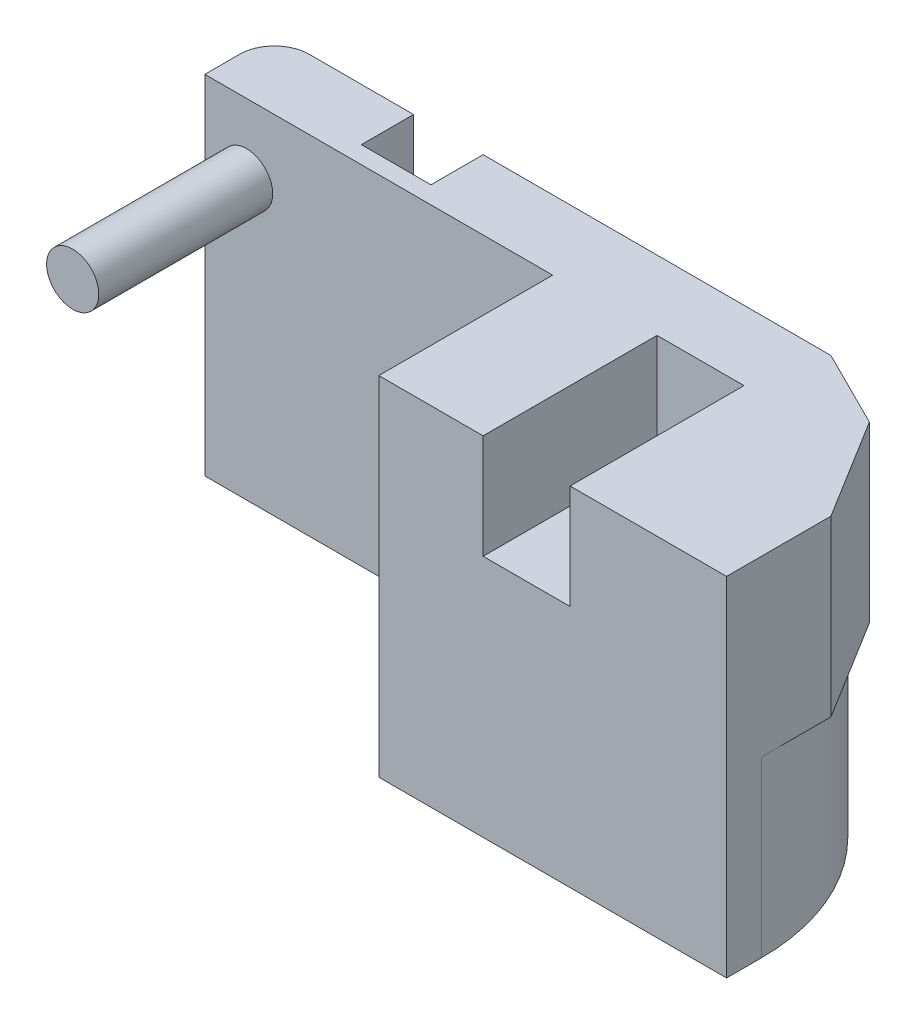
ISO-10303-21;
HEADER;
FILE_DESCRIPTION(('STEP AP214'),'2;1');
FILE_NAME('part.step','',(''),(''),'','','');
FILE_SCHEMA(('AUTOMOTIVE_DESIGN { 1 0 10303 214 1 1 1 1 }'));
ENDSEC;
DATA;
#1=APPLICATION_CONTEXT('core data for automotive mechanical design processes');
#2=APPLICATION_PROTOCOL_DEFINITION('international standard','automotive_design',2000,#1);
#3=PRODUCT_CONTEXT('',#1,'mechanical');
#4=PRODUCT('Part','Part','',(#3));
#5=PRODUCT_RELATED_PRODUCT_CATEGORY('part','',(#4));
#6=PRODUCT_DEFINITION_FORMATION('','',#4);
#7=PRODUCT_DEFINITION_CONTEXT('part definition',#1,'design');
#8=PRODUCT_DEFINITION('design','',#6,#7);
#9=PRODUCT_DEFINITION_SHAPE('','',#8);
#10=(LENGTH_UNIT() NAMED_UNIT(*) SI_UNIT(.MILLI.,.METRE.));
#11=(NAMED_UNIT(*) PLANE_ANGLE_UNIT() SI_UNIT($,.RADIAN.));
#12=(NAMED_UNIT(*) SI_UNIT($,.STERADIAN.) SOLID_ANGLE_UNIT());
#13=UNCERTAINTY_MEASURE_WITH_UNIT(LENGTH_MEASURE(1.E-05),#10,'distance_accuracy_value','');
#14=(GEOMETRIC_REPRESENTATION_CONTEXT(3) GLOBAL_UNCERTAINTY_ASSIGNED_CONTEXT((#13)) GLOBAL_UNIT_ASSIGNED_CONTEXT((#10,
#11,#12)) REPRESENTATION_CONTEXT('',''));
#15=CARTESIAN_POINT('',(0.,0.,0.));
#16=DIRECTION('',(0.,0.,1.));
#17=DIRECTION('',(1.,0.,0.));
#18=AXIS2_PLACEMENT_3D('',#15,#16,#17);
#19=CARTESIAN_POINT('',(0.,0.,20.));
#20=DIRECTION('',(0.,0.,-1.));
#21=DIRECTION('',(-1.,0.,0.));
#22=AXIS2_PLACEMENT_3D('',#19,#20,#21);
#23=PLANE('',#22);
#24=DIRECTION('',(-1.,0.,0.));
#25=VECTOR('',#24,1.);
#26=CARTESIAN_POINT('',(0.,100.,20.));
#27=LINE('',#26,#25);
#28=CARTESIAN_POINT('',(155.,100.,20.));
#29=VERTEX_POINT('',#28);
#30=CARTESIAN_POINT('',(130.,100.,20.));
#31=VERTEX_POINT('',#30);
#32=EDGE_CURVE('E331',#29,#31,#27,.T.);
#33=ORIENTED_EDGE('',*,*,#32,.T.);
#34=DIRECTION('',(0.,-1.,0.));
#35=VECTOR('',#34,1.);
#36=CARTESIAN_POINT('',(130.,100.,20.));
#37=LINE('',#36,#35);
#38=CARTESIAN_POINT('',(130.,70.,20.));
#39=VERTEX_POINT('',#38);
#40=EDGE_CURVE('E274',#31,#39,#37,.T.);
#41=ORIENTED_EDGE('',*,*,#40,.T.);
#42=DIRECTION('',(1.,0.,0.));
#43=VECTOR('',#42,1.);
#44=CARTESIAN_POINT('',(130.,70.,20.));
#45=LINE('',#44,#43);
#46=CARTESIAN_POINT('',(155.,70.,20.));
#47=VERTEX_POINT('',#46);
#48=EDGE_CURVE('E302',#39,#47,#45,.T.);
#49=ORIENTED_EDGE('',*,*,#48,.T.);
#50=DIRECTION('',(0.,-1.,0.));
#51=VECTOR('',#50,1.);
#52=CARTESIAN_POINT('',(155.,100.,20.));
#53=LINE('',#52,#51);
#54=EDGE_CURVE('E305',#29,#47,#53,.T.);
#55=ORIENTED_EDGE('',*,*,#54,.F.);
#56=EDGE_LOOP('',(#33,#41,#49,#55));
#57=FACE_BOUND('',#56,.T.);
#58=ADVANCED_FACE('F40',(#57),#23,.F.);
#59=CARTESIAN_POINT('',(0.,0.,20.));
#60=DIRECTION('',(1.,0.,0.));
#61=DIRECTION('',(0.,0.,-1.));
#62=AXIS2_PLACEMENT_3D('',#59,#60,#61);
#63=PLANE('',#62);
#64=DIRECTION('',(0.,0.,-1.));
#65=VECTOR('',#64,1.);
#66=CARTESIAN_POINT('',(0.,50.,10.));
#67=LINE('',#66,#65);
#68=CARTESIAN_POINT('',(0.,50.,10.));
#69=VERTEX_POINT('',#68);
#70=CARTESIAN_POINT('',(0.,50.,5.00000000000003));
#71=VERTEX_POINT('',#70);
#72=EDGE_CURVE('E350',#69,#71,#67,.T.);
#73=ORIENTED_EDGE('',*,*,#72,.T.);
#74=DIRECTION('',(0.,-1.,0.));
#75=VECTOR('',#74,1.);
#76=CARTESIAN_POINT('',(0.,0.,5.00000000000003));
#77=LINE('',#76,#75);
#78=CARTESIAN_POINT('',(0.,0.,5.00000000000003));
#79=VERTEX_POINT('',#78);
#80=EDGE_CURVE('E362',#71,#79,#77,.T.);
#81=ORIENTED_EDGE('',*,*,#80,.T.);
#82=DIRECTION('',(0.,0.,-1.));
#83=VECTOR('',#82,1.);
#84=CARTESIAN_POINT('',(0.,0.,20.));
#85=LINE('',#84,#83);
#86=CARTESIAN_POINT('',(0.,0.,20.));
#87=VERTEX_POINT('',#86);
#88=EDGE_CURVE('E344',#87,#79,#85,.T.);
#89=ORIENTED_EDGE('',*,*,#88,.F.);
#90=DIRECTION('',(0.,-1.,0.));
#91=VECTOR('',#90,1.);
#92=CARTESIAN_POINT('',(0.,0.,20.));
#93=LINE('',#92,#91);
#94=CARTESIAN_POINT('',(0.,100.,20.));
#95=VERTEX_POINT('',#94);
#96=EDGE_CURVE('E322',#95,#87,#93,.T.);
#97=ORIENTED_EDGE('',*,*,#96,.F.);
#98=DIRECTION('',(0.,0.,-1.));
#99=VECTOR('',#98,1.);
#100=CARTESIAN_POINT('',(0.,100.,20.));
#101=LINE('',#100,#99);
#102=CARTESIAN_POINT('',(0.,100.,10.));
#103=VERTEX_POINT('',#102);
#104=EDGE_CURVE('E336',#95,#103,#101,.T.);
#105=ORIENTED_EDGE('',*,*,#104,.T.);
#106=DIRECTION('',(0.,-1.,0.));
#107=VECTOR('',#106,1.);
#108=CARTESIAN_POINT('',(0.,0.,10.));
#109=LINE('',#108,#107);
#110=EDGE_CURVE('E353',#103,#69,#109,.T.);
#111=ORIENTED_EDGE('',*,*,#110,.T.);
#112=EDGE_LOOP('',(#73,#81,#89,#97,#105,#111));
#113=FACE_BOUND('',#112,.T.);
#114=ADVANCED_FACE('F434',(#113),#63,.F.);
#115=CARTESIAN_POINT('',(0.,0.,20.));
#116=DIRECTION('',(0.,1.,0.));
#117=DIRECTION('',(0.,0.,1.));
#118=AXIS2_PLACEMENT_3D('',#115,#116,#117);
#119=PLANE('',#118);
#120=DIRECTION('',(1.,0.,0.));
#121=VECTOR('',#120,1.);
#122=CARTESIAN_POINT('',(0.,0.,0.));
#123=LINE('',#122,#121);
#124=CARTESIAN_POINT('',(5.00000000000006,0.,0.));
#125=VERTEX_POINT('',#124);
#126=CARTESIAN_POINT('',(140.,0.,0.));
#127=VERTEX_POINT('',#126);
#128=EDGE_CURVE('E312',#125,#127,#123,.T.);
#129=ORIENTED_EDGE('',*,*,#128,.T.);
#130=CARTESIAN_POINT('',(140.,0.,60.));
#131=DIRECTION('',(0.,1.,0.));
#132=DIRECTION('',(0.,0.,1.));
#133=AXIS2_PLACEMENT_3D('',#130,#131,#132);
#134=CIRCLE('',#133,60.);
#135=CARTESIAN_POINT('',(200.,0.,60.));
#136=VERTEX_POINT('',#135);
#137=EDGE_CURVE('E382',#127,#136,#134,.F.);
#138=ORIENTED_EDGE('',*,*,#137,.T.);
#139=DIRECTION('',(0.,0.,-1.));
#140=VECTOR('',#139,1.);
#141=CARTESIAN_POINT('',(200.,0.,20.));
#142=LINE('',#141,#140);
#143=CARTESIAN_POINT('',(200.,0.,70.));
#144=VERTEX_POINT('',#143);
#145=EDGE_CURVE('E341',#144,#136,#142,.T.);
#146=ORIENTED_EDGE('',*,*,#145,.F.);
#147=DIRECTION('',(1.,0.,0.));
#148=VECTOR('',#147,1.);
#149=CARTESIAN_POINT('',(100.,0.,70.));
#150=LINE('',#149,#148);
#151=CARTESIAN_POINT('',(100.,0.,70.));
#152=VERTEX_POINT('',#151);
#153=EDGE_CURVE('E293',#152,#144,#150,.T.);
#154=ORIENTED_EDGE('',*,*,#153,.F.);
#155=DIRECTION('',(0.,0.,-1.));
#156=VECTOR('',#155,1.);
#157=CARTESIAN_POINT('',(100.,0.,70.));
#158=LINE('',#157,#156);
#159=CARTESIAN_POINT('',(100.,0.,20.));
#160=VERTEX_POINT('',#159);
#161=EDGE_CURVE('E313',#152,#160,#158,.T.);
#162=ORIENTED_EDGE('',*,*,#161,.T.);
#163=DIRECTION('',(1.,0.,0.));
#164=VECTOR('',#163,1.);
#165=CARTESIAN_POINT('',(0.,0.,20.));
#166=LINE('',#165,#164);
#167=EDGE_CURVE('E325',#87,#160,#166,.T.);
#168=ORIENTED_EDGE('',*,*,#167,.F.);
#169=ORIENTED_EDGE('',*,*,#88,.T.);
#170=DIRECTION('',(0.707106781186549,0.,-0.707106781186546));
#171=VECTOR('',#170,1.);
#172=CARTESIAN_POINT('',(0.,0.,5.00000000000003));
#173=LINE('',#172,#171);
#174=EDGE_CURVE('E366',#79,#125,#173,.T.);
#175=ORIENTED_EDGE('',*,*,#174,.T.);
#176=EDGE_LOOP('',(#129,#138,#146,#154,#162,#168,#169,#175));
#177=FACE_BOUND('',#176,.T.);
#178=ADVANCED_FACE('F441',(#177),#119,.F.);
#179=CARTESIAN_POINT('',(200.,0.,20.));
#180=DIRECTION('',(-1.,0.,0.));
#181=DIRECTION('',(0.,0.,1.));
#182=AXIS2_PLACEMENT_3D('',#179,#180,#181);
#183=PLANE('',#182);
#184=DIRECTION('',(0.,0.,-1.));
#185=VECTOR('',#184,1.);
#186=CARTESIAN_POINT('',(200.,49.9999999999999,60.));
#187=LINE('',#186,#185);
#188=CARTESIAN_POINT('',(200.,49.9999999999999,60.));
#189=VERTEX_POINT('',#188);
#190=CARTESIAN_POINT('',(200.,49.9999999999999,40.0000000000002));
#191=VERTEX_POINT('',#190);
#192=EDGE_CURVE('E372',#189,#191,#187,.T.);
#193=ORIENTED_EDGE('',*,*,#192,.T.);
#194=DIRECTION('',(0.,1.,0.));
#195=VECTOR('',#194,1.);
#196=CARTESIAN_POINT('',(200.,100.,40.0000000000002));
#197=LINE('',#196,#195);
#198=CARTESIAN_POINT('',(200.,100.,40.0000000000002));
#199=VERTEX_POINT('',#198);
#200=EDGE_CURVE('E391',#191,#199,#197,.T.);
#201=ORIENTED_EDGE('',*,*,#200,.T.);
#202=DIRECTION('',(0.,0.,-1.));
#203=VECTOR('',#202,1.);
#204=CARTESIAN_POINT('',(200.,100.,20.));
#205=LINE('',#204,#203);
#206=CARTESIAN_POINT('',(200.,100.,70.));
#207=VERTEX_POINT('',#206);
#208=EDGE_CURVE('E339',#207,#199,#205,.T.);
#209=ORIENTED_EDGE('',*,*,#208,.F.);
#210=DIRECTION('',(0.,1.,0.));
#211=VECTOR('',#210,1.);
#212=CARTESIAN_POINT('',(200.,0.,70.));
#213=LINE('',#212,#211);
#214=EDGE_CURVE('E290',#144,#207,#213,.T.);
#215=ORIENTED_EDGE('',*,*,#214,.F.);
#216=ORIENTED_EDGE('',*,*,#145,.T.);
#217=DIRECTION('',(0.,1.,0.));
#218=VECTOR('',#217,1.);
#219=CARTESIAN_POINT('',(200.,100.,60.));
#220=LINE('',#219,#218);
#221=EDGE_CURVE('E375',#136,#189,#220,.T.);
#222=ORIENTED_EDGE('',*,*,#221,.T.);
#223=EDGE_LOOP('',(#193,#201,#209,#215,#216,#222));
#224=FACE_BOUND('',#223,.T.);
#225=ADVANCED_FACE('F397',(#224),#183,.F.);
#226=CARTESIAN_POINT('',(0.,100.,20.));
#227=DIRECTION('',(0.,-1.,0.));
#228=DIRECTION('',(0.,0.,-1.));
#229=AXIS2_PLACEMENT_3D('',#226,#227,#228);
#230=PLANE('',#229);
#231=ORIENTED_EDGE('',*,*,#208,.T.);
#232=DIRECTION('',(-0.525731112119134,0.,-0.850650808352039));
#233=VECTOR('',#232,1.);
#234=CARTESIAN_POINT('',(200.,100.,40.0000000000002));
#235=LINE('',#234,#233);
#236=CARTESIAN_POINT('',(182.111456180002,100.,11.0557280900008));
#237=VERTEX_POINT('',#236);
#238=EDGE_CURVE('E64',#199,#237,#235,.T.);
#239=ORIENTED_EDGE('',*,*,#238,.T.);
#240=DIRECTION('',(-0.894427190999917,0.,-0.447213595499955));
#241=VECTOR('',#240,1.);
#242=CARTESIAN_POINT('',(200.,100.,20.));
#243=LINE('',#242,#241);
#244=CARTESIAN_POINT('',(160.,100.,0.));
#245=VERTEX_POINT('',#244);
#246=EDGE_CURVE('E384',#237,#245,#243,.T.);
#247=ORIENTED_EDGE('',*,*,#246,.T.);
#248=DIRECTION('',(-1.,0.,0.));
#249=VECTOR('',#248,1.);
#250=CARTESIAN_POINT('',(0.,100.,0.));
#251=LINE('',#250,#249);
#252=CARTESIAN_POINT('',(60.,100.,0.));
#253=VERTEX_POINT('',#252);
#254=EDGE_CURVE('E326',#245,#253,#251,.T.);
#255=ORIENTED_EDGE('',*,*,#254,.T.);
#256=DIRECTION('',(0.,0.,-1.));
#257=VECTOR('',#256,1.);
#258=CARTESIAN_POINT('',(60.,100.,15.));
#259=LINE('',#258,#257);
#260=CARTESIAN_POINT('',(60.,100.,15.));
#261=VERTEX_POINT('',#260);
#262=EDGE_CURVE('E255',#261,#253,#259,.T.);
#263=ORIENTED_EDGE('',*,*,#262,.F.);
#264=DIRECTION('',(-1.,0.,0.));
#265=VECTOR('',#264,1.);
#266=CARTESIAN_POINT('',(60.,100.,15.));
#267=LINE('',#266,#265);
#268=CARTESIAN_POINT('',(40.,100.,15.));
#269=VERTEX_POINT('',#268);
#270=EDGE_CURVE('E258',#261,#269,#267,.T.);
#271=ORIENTED_EDGE('',*,*,#270,.T.);
#272=DIRECTION('',(0.,0.,-1.));
#273=VECTOR('',#272,1.);
#274=CARTESIAN_POINT('',(40.,100.,15.));
#275=LINE('',#274,#273);
#276=CARTESIAN_POINT('',(40.,100.,0.));
#277=VERTEX_POINT('',#276);
#278=EDGE_CURVE('E252',#269,#277,#275,.T.);
#279=ORIENTED_EDGE('',*,*,#278,.T.);
#280=CARTESIAN_POINT('',(10.,100.,0.));
#281=VERTEX_POINT('',#280);
#282=EDGE_CURVE('E334',#277,#281,#251,.T.);
#283=ORIENTED_EDGE('',*,*,#282,.T.);
#284=CARTESIAN_POINT('',(10.,100.,10.));
#285=DIRECTION('',(0.,-1.,0.));
#286=DIRECTION('',(0.,0.,-1.));
#287=AXIS2_PLACEMENT_3D('',#284,#285,#286);
#288=CIRCLE('',#287,10.);
#289=EDGE_CURVE('E360',#281,#103,#288,.F.);
#290=ORIENTED_EDGE('',*,*,#289,.T.);
#291=ORIENTED_EDGE('',*,*,#104,.F.);
#292=CARTESIAN_POINT('',(100.,100.,20.));
#293=VERTEX_POINT('',#292);
#294=EDGE_CURVE('E329',#293,#95,#27,.T.);
#295=ORIENTED_EDGE('',*,*,#294,.F.);
#296=DIRECTION('',(0.,0.,-1.));
#297=VECTOR('',#296,1.);
#298=CARTESIAN_POINT('',(100.,100.,70.));
#299=LINE('',#298,#297);
#300=CARTESIAN_POINT('',(100.,100.,70.));
#301=VERTEX_POINT('',#300);
#302=EDGE_CURVE('E310',#301,#293,#299,.T.);
#303=ORIENTED_EDGE('',*,*,#302,.F.);
#304=DIRECTION('',(1.,0.,0.));
#305=VECTOR('',#304,1.);
#306=CARTESIAN_POINT('',(100.,100.,70.));
#307=LINE('',#306,#305);
#308=CARTESIAN_POINT('',(130.,100.,70.));
#309=VERTEX_POINT('',#308);
#310=EDGE_CURVE('E275',#301,#309,#307,.T.);
#311=ORIENTED_EDGE('',*,*,#310,.T.);
#312=DIRECTION('',(0.,0.,-1.));
#313=VECTOR('',#312,1.);
#314=CARTESIAN_POINT('',(130.,100.,70.));
#315=LINE('',#314,#313);
#316=EDGE_CURVE('E299',#309,#31,#315,.T.);
#317=ORIENTED_EDGE('',*,*,#316,.T.);
#318=ORIENTED_EDGE('',*,*,#32,.F.);
#319=DIRECTION('',(0.,0.,-1.));
#320=VECTOR('',#319,1.);
#321=CARTESIAN_POINT('',(155.,100.,70.));
#322=LINE('',#321,#320);
#323=CARTESIAN_POINT('',(155.,100.,70.));
#324=VERTEX_POINT('',#323);
#325=EDGE_CURVE('E315',#324,#29,#322,.T.);
#326=ORIENTED_EDGE('',*,*,#325,.F.);
#327=DIRECTION('',(1.,0.,0.));
#328=VECTOR('',#327,1.);
#329=CARTESIAN_POINT('',(155.,100.,70.));
#330=LINE('',#329,#328);
#331=EDGE_CURVE('E287',#324,#207,#330,.T.);
#332=ORIENTED_EDGE('',*,*,#331,.T.);
#333=EDGE_LOOP('',(#231,#239,#247,#255,#263,#271,#279,#283,#290,#291,#295,#303,#311,#317,#318,
#326,#332));
#334=FACE_BOUND('',#333,.T.);
#335=ADVANCED_FACE('F402',(#334),#230,.F.);
#336=CARTESIAN_POINT('',(12.,80.,20.));
#337=DIRECTION('',(0.,0.,-1.));
#338=DIRECTION('',(-1.,0.,0.));
#339=AXIS2_PLACEMENT_3D('',#336,#337,#338);
#340=CIRCLE('',#339,7.5);
#341=CARTESIAN_POINT('',(4.5,80.,20.));
#342=VERTEX_POINT('',#341);
#343=EDGE_CURVE('E347',#342,#342,#340,.F.);
#344=ORIENTED_EDGE('',*,*,#343,.F.);
#345=EDGE_LOOP('',(#344));
#346=FACE_BOUND('',#345,.T.);
#347=ORIENTED_EDGE('',*,*,#167,.T.);
#348=DIRECTION('',(0.,1.,0.));
#349=VECTOR('',#348,1.);
#350=CARTESIAN_POINT('',(100.,0.,20.));
#351=LINE('',#350,#349);
#352=EDGE_CURVE('E279',#160,#293,#351,.T.);
#353=ORIENTED_EDGE('',*,*,#352,.T.);
#354=ORIENTED_EDGE('',*,*,#294,.T.);
#355=ORIENTED_EDGE('',*,*,#96,.T.);
#356=EDGE_LOOP('',(#347,#353,#354,#355));
#357=FACE_BOUND('',#356,.T.);
#358=ADVANCED_FACE('F437',(#346,#357),#23,.F.);
#359=CARTESIAN_POINT('',(0.,0.,0.));
#360=DIRECTION('',(0.,0.,-1.));
#361=DIRECTION('',(-1.,0.,0.));
#362=AXIS2_PLACEMENT_3D('',#359,#360,#361);
#363=PLANE('',#362);
#364=CARTESIAN_POINT('',(120.,20.,0.));
#365=DIRECTION('',(0.,0.,-1.));
#366=DIRECTION('',(-1.,0.,0.));
#367=AXIS2_PLACEMENT_3D('',#364,#365,#366);
#368=CIRCLE('',#367,15.);
#369=CARTESIAN_POINT('',(105.,20.,0.));
#370=VERTEX_POINT('',#369);
#371=EDGE_CURVE('E232',#370,#370,#368,.T.);
#372=ORIENTED_EDGE('',*,*,#371,.F.);
#373=EDGE_LOOP('',(#372));
#374=FACE_BOUND('',#373,.T.);
#375=CARTESIAN_POINT('',(50.,20.,0.));
#376=DIRECTION('',(0.,0.,-1.));
#377=DIRECTION('',(-1.,0.,0.));
#378=AXIS2_PLACEMENT_3D('',#375,#376,#377);
#379=CIRCLE('',#378,15.);
#380=CARTESIAN_POINT('',(35.,20.,0.));
#381=VERTEX_POINT('',#380);
#382=EDGE_CURVE('E45',#381,#381,#379,.F.);
#383=ORIENTED_EDGE('',*,*,#382,.T.);
#384=EDGE_LOOP('',(#383));
#385=FACE_BOUND('',#384,.T.);
#386=DIRECTION('',(0.,1.,0.));
#387=VECTOR('',#386,1.);
#388=CARTESIAN_POINT('',(70.,90.,0.));
#389=LINE('',#388,#387);
#390=CARTESIAN_POINT('',(70.,65.,0.));
#391=VERTEX_POINT('',#390);
#392=CARTESIAN_POINT('',(70.,90.,0.));
#393=VERTEX_POINT('',#392);
#394=EDGE_CURVE('E209',#391,#393,#389,.T.);
#395=ORIENTED_EDGE('',*,*,#394,.F.);
#396=DIRECTION('',(-1.,0.,0.));
#397=VECTOR('',#396,1.);
#398=CARTESIAN_POINT('',(70.,65.,0.));
#399=LINE('',#398,#397);
#400=CARTESIAN_POINT('',(110.,65.,0.));
#401=VERTEX_POINT('',#400);
#402=EDGE_CURVE('E226',#401,#391,#399,.T.);
#403=ORIENTED_EDGE('',*,*,#402,.F.);
#404=DIRECTION('',(0.,-1.,0.));
#405=VECTOR('',#404,1.);
#406=CARTESIAN_POINT('',(110.,90.,0.));
#407=LINE('',#406,#405);
#408=CARTESIAN_POINT('',(110.,90.,0.));
#409=VERTEX_POINT('',#408);
#410=EDGE_CURVE('E229',#409,#401,#407,.T.);
#411=ORIENTED_EDGE('',*,*,#410,.F.);
#412=DIRECTION('',(1.,0.,0.));
#413=VECTOR('',#412,1.);
#414=CARTESIAN_POINT('',(70.,90.,0.));
#415=LINE('',#414,#413);
#416=EDGE_CURVE('E238',#393,#409,#415,.T.);
#417=ORIENTED_EDGE('',*,*,#416,.F.);
#418=EDGE_LOOP('',(#395,#403,#411,#417));
#419=FACE_BOUND('',#418,.T.);
#420=ORIENTED_EDGE('',*,*,#254,.F.);
#421=DIRECTION('',(0.,-1.,0.));
#422=VECTOR('',#421,1.);
#423=CARTESIAN_POINT('',(160.,49.9999999999999,0.));
#424=LINE('',#423,#422);
#425=CARTESIAN_POINT('',(160.,49.9999999999999,0.));
#426=VERTEX_POINT('',#425);
#427=EDGE_CURVE('E387',#245,#426,#424,.T.);
#428=ORIENTED_EDGE('',*,*,#427,.T.);
#429=DIRECTION('',(-1.,0.,0.));
#430=VECTOR('',#429,1.);
#431=CARTESIAN_POINT('',(0.,49.9999999999999,0.));
#432=LINE('',#431,#430);
#433=CARTESIAN_POINT('',(140.,49.9999999999999,0.));
#434=VERTEX_POINT('',#433);
#435=EDGE_CURVE('E380',#426,#434,#432,.T.);
#436=ORIENTED_EDGE('',*,*,#435,.T.);
#437=DIRECTION('',(0.,1.,0.));
#438=VECTOR('',#437,1.);
#439=CARTESIAN_POINT('',(140.,0.,0.));
#440=LINE('',#439,#438);
#441=EDGE_CURVE('E378',#434,#127,#440,.F.);
#442=ORIENTED_EDGE('',*,*,#441,.T.);
#443=ORIENTED_EDGE('',*,*,#128,.F.);
#444=DIRECTION('',(0.,1.,0.));
#445=VECTOR('',#444,1.);
#446=CARTESIAN_POINT('',(5.00000000000006,49.9999999999999,0.));
#447=LINE('',#446,#445);
#448=CARTESIAN_POINT('',(5.00000000000006,50.,0.));
#449=VERTEX_POINT('',#448);
#450=EDGE_CURVE('E368',#125,#449,#447,.T.);
#451=ORIENTED_EDGE('',*,*,#450,.T.);
#452=DIRECTION('',(1.,0.,0.));
#453=VECTOR('',#452,1.);
#454=CARTESIAN_POINT('',(0.,50.,0.));
#455=LINE('',#454,#453);
#456=CARTESIAN_POINT('',(10.,50.,0.));
#457=VERTEX_POINT('',#456);
#458=EDGE_CURVE('E358',#449,#457,#455,.T.);
#459=ORIENTED_EDGE('',*,*,#458,.T.);
#460=DIRECTION('',(0.,-1.,0.));
#461=VECTOR('',#460,1.);
#462=CARTESIAN_POINT('',(10.,100.,0.));
#463=LINE('',#462,#461);
#464=EDGE_CURVE('E356',#457,#281,#463,.F.);
#465=ORIENTED_EDGE('',*,*,#464,.T.);
#466=ORIENTED_EDGE('',*,*,#282,.F.);
#467=DIRECTION('',(0.,-1.,0.));
#468=VECTOR('',#467,1.);
#469=CARTESIAN_POINT('',(40.,100.,0.));
#470=LINE('',#469,#468);
#471=CARTESIAN_POINT('',(40.,70.,0.));
#472=VERTEX_POINT('',#471);
#473=EDGE_CURVE('E261',#277,#472,#470,.T.);
#474=ORIENTED_EDGE('',*,*,#473,.T.);
#475=DIRECTION('',(-1.,0.,0.));
#476=VECTOR('',#475,1.);
#477=CARTESIAN_POINT('',(60.,70.,0.));
#478=LINE('',#477,#476);
#479=CARTESIAN_POINT('',(60.,70.,0.));
#480=VERTEX_POINT('',#479);
#481=EDGE_CURVE('E268',#480,#472,#478,.T.);
#482=ORIENTED_EDGE('',*,*,#481,.F.);
#483=DIRECTION('',(0.,-1.,0.));
#484=VECTOR('',#483,1.);
#485=CARTESIAN_POINT('',(60.,100.,0.));
#486=LINE('',#485,#484);
#487=EDGE_CURVE('E251',#253,#480,#486,.T.);
#488=ORIENTED_EDGE('',*,*,#487,.F.);
#489=EDGE_LOOP('',(#420,#428,#436,#442,#443,#451,#459,#465,#466,#474,#482,#488));
#490=FACE_BOUND('',#489,.T.);
#491=ADVANCED_FACE('F448',(#374,#385,#419,#490),#363,.T.);
#492=CARTESIAN_POINT('',(100.,0.,70.));
#493=DIRECTION('',(-1.,0.,0.));
#494=DIRECTION('',(0.,0.,1.));
#495=AXIS2_PLACEMENT_3D('',#492,#493,#494);
#496=PLANE('',#495);
#497=ORIENTED_EDGE('',*,*,#352,.F.);
#498=ORIENTED_EDGE('',*,*,#161,.F.);
#499=DIRECTION('',(0.,1.,0.));
#500=VECTOR('',#499,1.);
#501=CARTESIAN_POINT('',(100.,0.,70.));
#502=LINE('',#501,#500);
#503=EDGE_CURVE('E296',#152,#301,#502,.T.);
#504=ORIENTED_EDGE('',*,*,#503,.T.);
#505=ORIENTED_EDGE('',*,*,#302,.T.);
#506=EDGE_LOOP('',(#497,#498,#504,#505));
#507=FACE_BOUND('',#506,.T.);
#508=ADVANCED_FACE('F454',(#507),#496,.T.);
#509=CARTESIAN_POINT('',(155.,100.,70.));
#510=DIRECTION('',(1.,0.,0.));
#511=DIRECTION('',(0.,0.,-1.));
#512=AXIS2_PLACEMENT_3D('',#509,#510,#511);
#513=PLANE('',#512);
#514=ORIENTED_EDGE('',*,*,#54,.T.);
#515=DIRECTION('',(0.,0.,-1.));
#516=VECTOR('',#515,1.);
#517=CARTESIAN_POINT('',(155.,70.,70.));
#518=LINE('',#517,#516);
#519=CARTESIAN_POINT('',(155.,70.,70.));
#520=VERTEX_POINT('',#519);
#521=EDGE_CURVE('E317',#520,#47,#518,.T.);
#522=ORIENTED_EDGE('',*,*,#521,.F.);
#523=DIRECTION('',(0.,-1.,0.));
#524=VECTOR('',#523,1.);
#525=CARTESIAN_POINT('',(155.,100.,70.));
#526=LINE('',#525,#524);
#527=EDGE_CURVE('E285',#324,#520,#526,.T.);
#528=ORIENTED_EDGE('',*,*,#527,.F.);
#529=ORIENTED_EDGE('',*,*,#325,.T.);
#530=EDGE_LOOP('',(#514,#522,#528,#529));
#531=FACE_BOUND('',#530,.T.);
#532=ADVANCED_FACE('F472',(#531),#513,.F.);
#533=CARTESIAN_POINT('',(130.,70.,70.));
#534=DIRECTION('',(0.,1.,0.));
#535=DIRECTION('',(0.,0.,1.));
#536=AXIS2_PLACEMENT_3D('',#533,#534,#535);
#537=PLANE('',#536);
#538=ORIENTED_EDGE('',*,*,#48,.F.);
#539=DIRECTION('',(0.,0.,-1.));
#540=VECTOR('',#539,1.);
#541=CARTESIAN_POINT('',(130.,70.,70.));
#542=LINE('',#541,#540);
#543=CARTESIAN_POINT('',(130.,70.,70.));
#544=VERTEX_POINT('',#543);
#545=EDGE_CURVE('E319',#544,#39,#542,.T.);
#546=ORIENTED_EDGE('',*,*,#545,.F.);
#547=DIRECTION('',(1.,0.,0.));
#548=VECTOR('',#547,1.);
#549=CARTESIAN_POINT('',(130.,70.,70.));
#550=LINE('',#549,#548);
#551=EDGE_CURVE('E282',#544,#520,#550,.T.);
#552=ORIENTED_EDGE('',*,*,#551,.T.);
#553=ORIENTED_EDGE('',*,*,#521,.T.);
#554=EDGE_LOOP('',(#538,#546,#552,#553));
#555=FACE_BOUND('',#554,.T.);
#556=ADVANCED_FACE('F474',(#555),#537,.T.);
#557=CARTESIAN_POINT('',(130.,100.,70.));
#558=DIRECTION('',(1.,0.,0.));
#559=DIRECTION('',(0.,0.,-1.));
#560=AXIS2_PLACEMENT_3D('',#557,#558,#559);
#561=PLANE('',#560);
#562=ORIENTED_EDGE('',*,*,#40,.F.);
#563=ORIENTED_EDGE('',*,*,#316,.F.);
#564=DIRECTION('',(0.,-1.,0.));
#565=VECTOR('',#564,1.);
#566=CARTESIAN_POINT('',(130.,100.,70.));
#567=LINE('',#566,#565);
#568=EDGE_CURVE('E278',#309,#544,#567,.T.);
#569=ORIENTED_EDGE('',*,*,#568,.T.);
#570=ORIENTED_EDGE('',*,*,#545,.T.);
#571=EDGE_LOOP('',(#562,#563,#569,#570));
#572=FACE_BOUND('',#571,.T.);
#573=ADVANCED_FACE('F468',(#572),#561,.T.);
#574=CARTESIAN_POINT('',(0.,0.,70.));
#575=DIRECTION('',(0.,0.,-1.));
#576=DIRECTION('',(-1.,0.,0.));
#577=AXIS2_PLACEMENT_3D('',#574,#575,#576);
#578=PLANE('',#577);
#579=ORIENTED_EDGE('',*,*,#310,.F.);
#580=ORIENTED_EDGE('',*,*,#503,.F.);
#581=ORIENTED_EDGE('',*,*,#153,.T.);
#582=ORIENTED_EDGE('',*,*,#214,.T.);
#583=ORIENTED_EDGE('',*,*,#331,.F.);
#584=ORIENTED_EDGE('',*,*,#527,.T.);
#585=ORIENTED_EDGE('',*,*,#551,.F.);
#586=ORIENTED_EDGE('',*,*,#568,.F.);
#587=EDGE_LOOP('',(#579,#580,#581,#582,#583,#584,#585,#586));
#588=FACE_BOUND('',#587,.T.);
#589=ADVANCED_FACE('F408',(#588),#578,.F.);
#590=CARTESIAN_POINT('',(12.,80.,70.));
#591=DIRECTION('',(0.,0.,-1.));
#592=DIRECTION('',(-1.,0.,0.));
#593=AXIS2_PLACEMENT_3D('',#590,#591,#592);
#594=CYLINDRICAL_SURFACE('',#593,7.5);
#595=CARTESIAN_POINT('',(12.,80.,70.));
#596=DIRECTION('',(0.,0.,1.));
#597=DIRECTION('',(1.,0.,0.));
#598=AXIS2_PLACEMENT_3D('',#595,#596,#597);
#599=CIRCLE('',#598,7.5);
#600=CARTESIAN_POINT('',(4.5,80.,70.));
#601=VERTEX_POINT('',#600);
#602=EDGE_CURVE('E271',#601,#601,#599,.T.);
#603=CARTESIAN_POINT('',(4.5,80.,70.));
#604=CARTESIAN_POINT('',(4.5,80.,69.4791666666667));
#605=CARTESIAN_POINT('',(4.5,80.,68.9583333333333));
#606=CARTESIAN_POINT('',(4.5,80.,67.9166666666667));
#607=CARTESIAN_POINT('',(4.5,80.,67.3958333333333));
#608=CARTESIAN_POINT('',(4.5,80.,66.3541666666667));
#609=CARTESIAN_POINT('',(4.5,80.,65.8333333333333));
#610=CARTESIAN_POINT('',(4.5,80.,64.7916666666667));
#611=CARTESIAN_POINT('',(4.5,80.,64.2708333333333));
#612=CARTESIAN_POINT('',(4.5,80.,63.2291666666667));
#613=CARTESIAN_POINT('',(4.5,80.,62.7083333333333));
#614=CARTESIAN_POINT('',(4.5,80.,61.6666666666667));
#615=CARTESIAN_POINT('',(4.5,80.,61.1458333333333));
#616=CARTESIAN_POINT('',(4.5,80.,60.1041666666667));
#617=CARTESIAN_POINT('',(4.5,80.,59.5833333333333));
#618=CARTESIAN_POINT('',(4.5,80.,58.5416666666667));
#619=CARTESIAN_POINT('',(4.5,80.,58.0208333333333));
#620=CARTESIAN_POINT('',(4.5,80.,56.9791666666667));
#621=CARTESIAN_POINT('',(4.5,80.,56.4583333333333));
#622=CARTESIAN_POINT('',(4.5,80.,55.4166666666667));
#623=CARTESIAN_POINT('',(4.5,80.,54.8958333333333));
#624=CARTESIAN_POINT('',(4.5,80.,53.8541666666667));
#625=CARTESIAN_POINT('',(4.5,80.,53.3333333333333));
#626=CARTESIAN_POINT('',(4.5,80.,52.2916666666667));
#627=CARTESIAN_POINT('',(4.5,80.,51.7708333333333));
#628=CARTESIAN_POINT('',(4.5,80.,50.7291666666667));
#629=CARTESIAN_POINT('',(4.5,80.,50.2083333333333));
#630=CARTESIAN_POINT('',(4.5,80.,49.1666666666667));
#631=CARTESIAN_POINT('',(4.5,80.,48.6458333333333));
#632=CARTESIAN_POINT('',(4.5,80.,47.6041666666667));
#633=CARTESIAN_POINT('',(4.5,80.,47.0833333333333));
#634=CARTESIAN_POINT('',(4.5,80.,46.0416666666667));
#635=CARTESIAN_POINT('',(4.5,80.,45.5208333333333));
#636=CARTESIAN_POINT('',(4.5,80.,44.4791666666667));
#637=CARTESIAN_POINT('',(4.5,80.,43.9583333333333));
#638=CARTESIAN_POINT('',(4.5,80.,42.9166666666667));
#639=CARTESIAN_POINT('',(4.5,80.,42.3958333333333));
#640=CARTESIAN_POINT('',(4.5,80.,41.3541666666667));
#641=CARTESIAN_POINT('',(4.5,80.,40.8333333333333));
#642=CARTESIAN_POINT('',(4.5,80.,39.7916666666667));
#643=CARTESIAN_POINT('',(4.5,80.,39.2708333333333));
#644=CARTESIAN_POINT('',(4.5,80.,38.2291666666667));
#645=CARTESIAN_POINT('',(4.5,80.,37.7083333333333));
#646=CARTESIAN_POINT('',(4.5,80.,36.6666666666667));
#647=CARTESIAN_POINT('',(4.5,80.,36.1458333333333));
#648=CARTESIAN_POINT('',(4.5,80.,35.1041666666667));
#649=CARTESIAN_POINT('',(4.5,80.,34.5833333333333));
#650=CARTESIAN_POINT('',(4.5,80.,33.5416666666667));
#651=CARTESIAN_POINT('',(4.5,80.,33.0208333333333));
#652=CARTESIAN_POINT('',(4.5,80.,31.9791666666667));
#653=CARTESIAN_POINT('',(4.5,80.,31.4583333333333));
#654=CARTESIAN_POINT('',(4.5,80.,30.4166666666667));
#655=CARTESIAN_POINT('',(4.5,80.,29.8958333333333));
#656=CARTESIAN_POINT('',(4.5,80.,28.8541666666667));
#657=CARTESIAN_POINT('',(4.5,80.,28.3333333333333));
#658=CARTESIAN_POINT('',(4.5,80.,27.2916666666667));
#659=CARTESIAN_POINT('',(4.5,80.,26.7708333333333));
#660=CARTESIAN_POINT('',(4.5,80.,25.7291666666667));
#661=CARTESIAN_POINT('',(4.5,80.,25.2083333333333));
#662=CARTESIAN_POINT('',(4.5,80.,24.1666666666667));
#663=CARTESIAN_POINT('',(4.5,80.,23.6458333333333));
#664=CARTESIAN_POINT('',(4.5,80.,22.6041666666667));
#665=CARTESIAN_POINT('',(4.5,80.,22.0833333333333));
#666=CARTESIAN_POINT('',(4.5,80.,21.0416666666667));
#667=CARTESIAN_POINT('',(4.5,80.,20.5208333333333));
#668=CARTESIAN_POINT('',(4.5,80.,20.));
#669=B_SPLINE_CURVE_WITH_KNOTS('',3,(#603,#604,#605,#606,#607,#608,#609,#610,#611,#612,#613,
#614,#615,#616,#617,#618,#619,#620,#621,#622,#623,#624,#625,#626,#627,#628,#629,#630,#631,#632,
#633,#634,#635,#636,#637,#638,#639,#640,#641,#642,#643,#644,#645,#646,#647,#648,#649,#650,#651,
#652,#653,#654,#655,#656,#657,#658,#659,#660,#661,#662,#663,#664,#665,#666,#667,#668),
.UNSPECIFIED.,.F.,.F.,(4,2,2,2,2,2,2,2,2,2,2,2,2,2,2,2,2,2,2,2,2,2,2,2,2,2,2,2,2,2,2,2,4),(0.,
1.56249999999999,3.12499999999999,4.6875,6.24999999999999,7.81249999999999,9.37499999999999,
10.9375,12.5,14.0625,15.625,17.1875,18.75,20.3125,21.875,23.4375,25.,26.5625,28.125,29.6875,
31.25,32.8125,34.375,35.9375,37.5,39.0625,40.625,42.1875,43.75,45.3125,46.875,48.4375,50.),.UNSPECIFIED.);
#670=EDGE_CURVE('BSEAM487',#601,#342,#669,.T.);
#671=ORIENTED_EDGE('',*,*,#602,.F.);
#672=ORIENTED_EDGE('',*,*,#343,.T.);
#673=ORIENTED_EDGE('',*,*,#670,.T.);
#674=ORIENTED_EDGE('',*,*,#670,.F.);
#675=EDGE_LOOP('',(#671,#673,#672,#674));
#676=FACE_BOUND('',#675,.T.);
#677=ADVANCED_FACE('F487',(#676),#594,.T.);
#678=CARTESIAN_POINT('',(12.,80.,70.));
#679=DIRECTION('',(0.,0.,1.));
#680=DIRECTION('',(1.,0.,0.));
#681=AXIS2_PLACEMENT_3D('',#678,#679,#680);
#682=PLANE('',#681);
#683=ORIENTED_EDGE('',*,*,#602,.T.);
#684=EDGE_LOOP('',(#683));
#685=FACE_BOUND('',#684,.T.);
#686=ADVANCED_FACE('F490',(#685),#682,.T.);
#687=CARTESIAN_POINT('',(60.,100.,15.));
#688=DIRECTION('',(0.,0.447213595499958,-0.894427190999916));
#689=DIRECTION('',(0.,0.894427190999916,0.447213595499958));
#690=AXIS2_PLACEMENT_3D('',#687,#688,#689);
#691=PLANE('',#690);
#692=DIRECTION('',(0.,-0.894427190999916,-0.447213595499958));
#693=VECTOR('',#692,1.);
#694=CARTESIAN_POINT('',(40.,100.,15.));
#695=LINE('',#694,#693);
#696=EDGE_CURVE('E259',#269,#472,#695,.T.);
#697=ORIENTED_EDGE('',*,*,#696,.F.);
#698=ORIENTED_EDGE('',*,*,#270,.F.);
#699=DIRECTION('',(0.,-0.894427190999916,-0.447213595499958));
#700=VECTOR('',#699,1.);
#701=CARTESIAN_POINT('',(60.,100.,15.));
#702=LINE('',#701,#700);
#703=EDGE_CURVE('E249',#261,#480,#702,.T.);
#704=ORIENTED_EDGE('',*,*,#703,.T.);
#705=ORIENTED_EDGE('',*,*,#481,.T.);
#706=EDGE_LOOP('',(#697,#698,#704,#705));
#707=FACE_BOUND('',#706,.T.);
#708=ADVANCED_FACE('F494',(#707),#691,.T.);
#709=CARTESIAN_POINT('',(60.,0.,0.));
#710=DIRECTION('',(1.,0.,0.));
#711=DIRECTION('',(0.,0.,-1.));
#712=AXIS2_PLACEMENT_3D('',#709,#710,#711);
#713=PLANE('',#712);
#714=ORIENTED_EDGE('',*,*,#703,.F.);
#715=ORIENTED_EDGE('',*,*,#262,.T.);
#716=ORIENTED_EDGE('',*,*,#487,.T.);
#717=EDGE_LOOP('',(#714,#715,#716));
#718=FACE_BOUND('',#717,.T.);
#719=ADVANCED_FACE('F498',(#718),#713,.F.);
#720=CARTESIAN_POINT('',(40.,0.,0.));
#721=DIRECTION('',(1.,0.,0.));
#722=DIRECTION('',(0.,0.,-1.));
#723=AXIS2_PLACEMENT_3D('',#720,#721,#722);
#724=PLANE('',#723);
#725=ORIENTED_EDGE('',*,*,#696,.T.);
#726=ORIENTED_EDGE('',*,*,#473,.F.);
#727=ORIENTED_EDGE('',*,*,#278,.F.);
#728=EDGE_LOOP('',(#725,#726,#727));
#729=FACE_BOUND('',#728,.T.);
#730=ADVANCED_FACE('F500',(#729),#724,.T.);
#731=CARTESIAN_POINT('',(10.,50.,10.));
#732=DIRECTION('',(0.,1.,0.));
#733=DIRECTION('',(0.,0.,1.));
#734=AXIS2_PLACEMENT_3D('',#731,#732,#733);
#735=PLANE('',#734);
#736=ORIENTED_EDGE('',*,*,#458,.F.);
#737=DIRECTION('',(-0.707106781186549,0.,0.707106781186546));
#738=VECTOR('',#737,1.);
#739=CARTESIAN_POINT('',(2.50000000000004,50.,2.5));
#740=LINE('',#739,#738);
#741=EDGE_CURVE('E370',#449,#71,#740,.T.);
#742=ORIENTED_EDGE('',*,*,#741,.T.);
#743=ORIENTED_EDGE('',*,*,#72,.F.);
#744=CARTESIAN_POINT('',(10.,50.,10.));
#745=DIRECTION('',(0.,-1.,0.));
#746=DIRECTION('',(0.,0.,-1.));
#747=AXIS2_PLACEMENT_3D('',#744,#745,#746);
#748=CIRCLE('',#747,10.);
#749=EDGE_CURVE('E245',#457,#69,#748,.F.);
#750=ORIENTED_EDGE('',*,*,#749,.F.);
#751=EDGE_LOOP('',(#736,#742,#743,#750));
#752=FACE_BOUND('',#751,.T.);
#753=ADVANCED_FACE('F503',(#752),#735,.T.);
#754=CARTESIAN_POINT('',(10.,0.,10.));
#755=DIRECTION('',(0.,1.,0.));
#756=DIRECTION('',(0.,0.,1.));
#757=AXIS2_PLACEMENT_3D('',#754,#755,#756);
#758=CYLINDRICAL_SURFACE('',#757,10.);
#759=ORIENTED_EDGE('',*,*,#289,.F.);
#760=ORIENTED_EDGE('',*,*,#464,.F.);
#761=ORIENTED_EDGE('',*,*,#749,.T.);
#762=ORIENTED_EDGE('',*,*,#110,.F.);
#763=EDGE_LOOP('',(#759,#760,#761,#762));
#764=FACE_BOUND('',#763,.T.);
#765=ADVANCED_FACE('F511',(#764),#758,.T.);
#766=CARTESIAN_POINT('',(70.,90.,5.));
#767=DIRECTION('',(-1.,0.,0.));
#768=DIRECTION('',(0.,0.,1.));
#769=AXIS2_PLACEMENT_3D('',#766,#767,#768);
#770=PLANE('',#769);
#771=ORIENTED_EDGE('',*,*,#394,.T.);
#772=DIRECTION('',(0.,0.,-1.));
#773=VECTOR('',#772,1.);
#774=CARTESIAN_POINT('',(70.,90.,5.));
#775=LINE('',#774,#773);
#776=CARTESIAN_POINT('',(70.,90.,5.));
#777=VERTEX_POINT('',#776);
#778=EDGE_CURVE('E202',#777,#393,#775,.T.);
#779=ORIENTED_EDGE('',*,*,#778,.F.);
#780=DIRECTION('',(0.,1.,0.));
#781=VECTOR('',#780,1.);
#782=CARTESIAN_POINT('',(70.,90.,5.));
#783=LINE('',#782,#781);
#784=CARTESIAN_POINT('',(70.,65.,5.));
#785=VERTEX_POINT('',#784);
#786=EDGE_CURVE('E206',#785,#777,#783,.T.);
#787=ORIENTED_EDGE('',*,*,#786,.F.);
#788=DIRECTION('',(0.,0.,-1.));
#789=VECTOR('',#788,1.);
#790=CARTESIAN_POINT('',(70.,65.,5.));
#791=LINE('',#790,#789);
#792=EDGE_CURVE('E243',#785,#391,#791,.T.);
#793=ORIENTED_EDGE('',*,*,#792,.T.);
#794=EDGE_LOOP('',(#771,#779,#787,#793));
#795=FACE_BOUND('',#794,.T.);
#796=ADVANCED_FACE('F204',(#795),#770,.F.);
#797=CARTESIAN_POINT('',(70.,65.,5.));
#798=DIRECTION('',(0.,-1.,0.));
#799=DIRECTION('',(0.,0.,-1.));
#800=AXIS2_PLACEMENT_3D('',#797,#798,#799);
#801=PLANE('',#800);
#802=ORIENTED_EDGE('',*,*,#402,.T.);
#803=ORIENTED_EDGE('',*,*,#792,.F.);
#804=DIRECTION('',(-1.,0.,0.));
#805=VECTOR('',#804,1.);
#806=CARTESIAN_POINT('',(70.,65.,5.));
#807=LINE('',#806,#805);
#808=CARTESIAN_POINT('',(110.,65.,5.));
#809=VERTEX_POINT('',#808);
#810=EDGE_CURVE('E214',#809,#785,#807,.T.);
#811=ORIENTED_EDGE('',*,*,#810,.F.);
#812=DIRECTION('',(0.,0.,-1.));
#813=VECTOR('',#812,1.);
#814=CARTESIAN_POINT('',(110.,65.,5.));
#815=LINE('',#814,#813);
#816=EDGE_CURVE('E246',#809,#401,#815,.T.);
#817=ORIENTED_EDGE('',*,*,#816,.T.);
#818=EDGE_LOOP('',(#802,#803,#811,#817));
#819=FACE_BOUND('',#818,.T.);
#820=ADVANCED_FACE('F510',(#819),#801,.F.);
#821=CARTESIAN_POINT('',(110.,90.,5.));
#822=DIRECTION('',(1.,0.,0.));
#823=DIRECTION('',(0.,0.,-1.));
#824=AXIS2_PLACEMENT_3D('',#821,#822,#823);
#825=PLANE('',#824);
#826=ORIENTED_EDGE('',*,*,#410,.T.);
#827=ORIENTED_EDGE('',*,*,#816,.F.);
#828=DIRECTION('',(0.,-1.,0.));
#829=VECTOR('',#828,1.);
#830=CARTESIAN_POINT('',(110.,90.,5.));
#831=LINE('',#830,#829);
#832=CARTESIAN_POINT('',(110.,90.,5.));
#833=VERTEX_POINT('',#832);
#834=EDGE_CURVE('E222',#833,#809,#831,.T.);
#835=ORIENTED_EDGE('',*,*,#834,.F.);
#836=DIRECTION('',(0.,0.,-1.));
#837=VECTOR('',#836,1.);
#838=CARTESIAN_POINT('',(110.,90.,5.));
#839=LINE('',#838,#837);
#840=EDGE_CURVE('E213',#833,#409,#839,.T.);
#841=ORIENTED_EDGE('',*,*,#840,.T.);
#842=EDGE_LOOP('',(#826,#827,#835,#841));
#843=FACE_BOUND('',#842,.T.);
#844=ADVANCED_FACE('F514',(#843),#825,.F.);
#845=CARTESIAN_POINT('',(70.,90.,5.));
#846=DIRECTION('',(0.,1.,0.));
#847=DIRECTION('',(0.,0.,1.));
#848=AXIS2_PLACEMENT_3D('',#845,#846,#847);
#849=PLANE('',#848);
#850=ORIENTED_EDGE('',*,*,#416,.T.);
#851=ORIENTED_EDGE('',*,*,#840,.F.);
#852=DIRECTION('',(1.,0.,0.));
#853=VECTOR('',#852,1.);
#854=CARTESIAN_POINT('',(70.,90.,5.));
#855=LINE('',#854,#853);
#856=EDGE_CURVE('E217',#777,#833,#855,.T.);
#857=ORIENTED_EDGE('',*,*,#856,.F.);
#858=ORIENTED_EDGE('',*,*,#778,.T.);
#859=EDGE_LOOP('',(#850,#851,#857,#858));
#860=FACE_BOUND('',#859,.T.);
#861=ADVANCED_FACE('F218',(#860),#849,.F.);
#862=CARTESIAN_POINT('',(0.,0.,5.));
#863=DIRECTION('',(0.,0.,1.));
#864=DIRECTION('',(1.,0.,0.));
#865=AXIS2_PLACEMENT_3D('',#862,#863,#864);
#866=PLANE('',#865);
#867=ORIENTED_EDGE('',*,*,#786,.T.);
#868=ORIENTED_EDGE('',*,*,#856,.T.);
#869=ORIENTED_EDGE('',*,*,#834,.T.);
#870=ORIENTED_EDGE('',*,*,#810,.T.);
#871=EDGE_LOOP('',(#867,#868,#869,#870));
#872=FACE_BOUND('',#871,.T.);
#873=ADVANCED_FACE('F224',(#872),#866,.F.);
#874=CARTESIAN_POINT('',(0.,0.,5.00000000000003));
#875=DIRECTION('',(-0.707106781186546,0.,-0.707106781186549));
#876=DIRECTION('',(0.,1.,0.));
#877=AXIS2_PLACEMENT_3D('',#874,#875,#876);
#878=PLANE('',#877);
#879=ORIENTED_EDGE('',*,*,#741,.F.);
#880=ORIENTED_EDGE('',*,*,#450,.F.);
#881=ORIENTED_EDGE('',*,*,#174,.F.);
#882=ORIENTED_EDGE('',*,*,#80,.F.);
#883=EDGE_LOOP('',(#879,#880,#881,#882));
#884=FACE_BOUND('',#883,.T.);
#885=ADVANCED_FACE('F522',(#884),#878,.T.);
#886=CARTESIAN_POINT('',(140.,49.9999999999999,60.));
#887=DIRECTION('',(0.,-1.,0.));
#888=DIRECTION('',(0.,0.,-1.));
#889=AXIS2_PLACEMENT_3D('',#886,#887,#888);
#890=PLANE('',#889);
#891=DIRECTION('',(0.894427190999917,0.,0.447213595499955));
#892=VECTOR('',#891,1.);
#893=CARTESIAN_POINT('',(168.,49.9999999999999,4.00000000000002));
#894=LINE('',#893,#892);
#895=CARTESIAN_POINT('',(182.111456180002,49.9999999999999,11.0557280900008));
#896=VERTEX_POINT('',#895);
#897=EDGE_CURVE('E389',#426,#896,#894,.T.);
#898=ORIENTED_EDGE('',*,*,#897,.T.);
#899=DIRECTION('',(0.525731112119134,0.,0.850650808352039));
#900=VECTOR('',#899,1.);
#901=CARTESIAN_POINT('',(192.360679774998,49.9999999999999,27.6393202250021));
#902=LINE('',#901,#900);
#903=EDGE_CURVE('E11',#896,#191,#902,.T.);
#904=ORIENTED_EDGE('',*,*,#903,.T.);
#905=ORIENTED_EDGE('',*,*,#192,.F.);
#906=CARTESIAN_POINT('',(140.,49.9999999999999,60.));
#907=DIRECTION('',(0.,1.,0.));
#908=DIRECTION('',(0.,0.,1.));
#909=AXIS2_PLACEMENT_3D('',#906,#907,#908);
#910=CIRCLE('',#909,60.);
#911=EDGE_CURVE('E239',#434,#189,#910,.F.);
#912=ORIENTED_EDGE('',*,*,#911,.F.);
#913=ORIENTED_EDGE('',*,*,#435,.F.);
#914=EDGE_LOOP('',(#898,#904,#905,#912,#913));
#915=FACE_BOUND('',#914,.T.);
#916=ADVANCED_FACE('F422',(#915),#890,.T.);
#917=CARTESIAN_POINT('',(140.,0.,60.));
#918=DIRECTION('',(0.,-1.,0.));
#919=DIRECTION('',(0.,0.,-1.));
#920=AXIS2_PLACEMENT_3D('',#917,#918,#919);
#921=CYLINDRICAL_SURFACE('',#920,60.);
#922=ORIENTED_EDGE('',*,*,#137,.F.);
#923=ORIENTED_EDGE('',*,*,#441,.F.);
#924=ORIENTED_EDGE('',*,*,#911,.T.);
#925=ORIENTED_EDGE('',*,*,#221,.F.);
#926=EDGE_LOOP('',(#922,#923,#924,#925));
#927=FACE_BOUND('',#926,.T.);
#928=ADVANCED_FACE('F417',(#927),#921,.T.);
#929=CARTESIAN_POINT('',(200.,0.,20.));
#930=DIRECTION('',(0.447213595499955,0.,-0.894427190999917));
#931=DIRECTION('',(0.,-1.,0.));
#932=AXIS2_PLACEMENT_3D('',#929,#930,#931);
#933=PLANE('',#932);
#934=ORIENTED_EDGE('',*,*,#246,.F.);
#935=DIRECTION('',(0.,-1.,0.));
#936=VECTOR('',#935,1.);
#937=CARTESIAN_POINT('',(182.111456180002,49.9999999999999,11.0557280900008));
#938=LINE('',#937,#936);
#939=EDGE_CURVE('E50',#237,#896,#938,.T.);
#940=ORIENTED_EDGE('',*,*,#939,.T.);
#941=ORIENTED_EDGE('',*,*,#897,.F.);
#942=ORIENTED_EDGE('',*,*,#427,.F.);
#943=EDGE_LOOP('',(#934,#940,#941,#942));
#944=FACE_BOUND('',#943,.T.);
#945=ADVANCED_FACE('F425',(#944),#933,.T.);
#946=CARTESIAN_POINT('',(200.,0.,40.0000000000002));
#947=DIRECTION('',(0.850650808352039,0.,-0.525731112119134));
#948=DIRECTION('',(0.,-1.,0.));
#949=AXIS2_PLACEMENT_3D('',#946,#947,#948);
#950=PLANE('',#949);
#951=ORIENTED_EDGE('',*,*,#903,.F.);
#952=ORIENTED_EDGE('',*,*,#939,.F.);
#953=ORIENTED_EDGE('',*,*,#238,.F.);
#954=ORIENTED_EDGE('',*,*,#200,.F.);
#955=EDGE_LOOP('',(#951,#952,#953,#954));
#956=FACE_BOUND('',#955,.T.);
#957=ADVANCED_FACE('F43',(#956),#950,.T.);
#958=CARTESIAN_POINT('',(50.,20.,0.));
#959=DIRECTION('',(0.,1.,0.));
#960=DIRECTION('',(-1.,0.,0.));
#961=AXIS2_PLACEMENT_3D('',#958,#959,#960);
#962=SPHERICAL_SURFACE('',#961,15.);
#963=CARTESIAN_POINT('',(50.,20.,0.));
#964=DIRECTION('',(0.,0.,-1.));
#965=DIRECTION('',(-1.,0.,0.));
#966=AXIS2_PLACEMENT_3D('',#963,#964,#965);
#967=SPHERICAL_SURFACE('',#966,15.);
#968=ORIENTED_EDGE('',*,*,#382,.F.);
#969=EDGE_LOOP('',(#968));
#970=FACE_BOUND('',#969,.T.);
#971=ADVANCED_FACE('F424',(#970),#967,.F.);
#972=CARTESIAN_POINT('',(120.,20.,60.));
#973=DIRECTION('',(0.,0.,-1.));
#974=DIRECTION('',(-1.,0.,0.));
#975=AXIS2_PLACEMENT_3D('',#972,#973,#974);
#976=CYLINDRICAL_SURFACE('',#975,15.);
#977=CARTESIAN_POINT('',(120.,20.,60.));
#978=DIRECTION('',(0.,0.,-1.));
#979=DIRECTION('',(-1.,0.,0.));
#980=AXIS2_PLACEMENT_3D('',#977,#978,#979);
#981=CIRCLE('',#980,15.);
#982=CARTESIAN_POINT('',(105.,20.,60.));
#983=VERTEX_POINT('',#982);
#984=EDGE_CURVE('E534',#983,#983,#981,.T.);
#985=ORIENTED_EDGE('',*,*,#984,.F.);
#986=EDGE_LOOP('',(#985));
#987=FACE_BOUND('',#986,.T.);
#988=ORIENTED_EDGE('',*,*,#371,.T.);
#989=EDGE_LOOP('',(#988));
#990=FACE_BOUND('',#989,.T.);
#991=ADVANCED_FACE('F430',(#987,#990),#976,.F.);
#992=CARTESIAN_POINT('',(120.,20.,60.));
#993=DIRECTION('',(0.,0.,-1.));
#994=DIRECTION('',(-1.,0.,0.));
#995=AXIS2_PLACEMENT_3D('',#992,#993,#994);
#996=PLANE('',#995);
#997=ORIENTED_EDGE('',*,*,#984,.T.);
#998=EDGE_LOOP('',(#997));
#999=FACE_BOUND('',#998,.T.);
#1000=ADVANCED_FACE('F526',(#999),#996,.T.);
#1001=CLOSED_SHELL('',(#58,#114,#178,#225,#335,#358,#491,#508,#532,#556,#573,#589,#677,#686,
#708,#719,#730,#753,#765,#796,#820,#844,#861,#873,#885,#916,#928,#945,#957,#971,#991,#1000));
#1002=MANIFOLD_SOLID_BREP('B2',#1001);
#1003=ADVANCED_BREP_SHAPE_REPRESENTATION('',(#18,#1002),#14);
#1004=SHAPE_DEFINITION_REPRESENTATION(#9,#1003);
ENDSEC;
END-ISO-10303-21;
